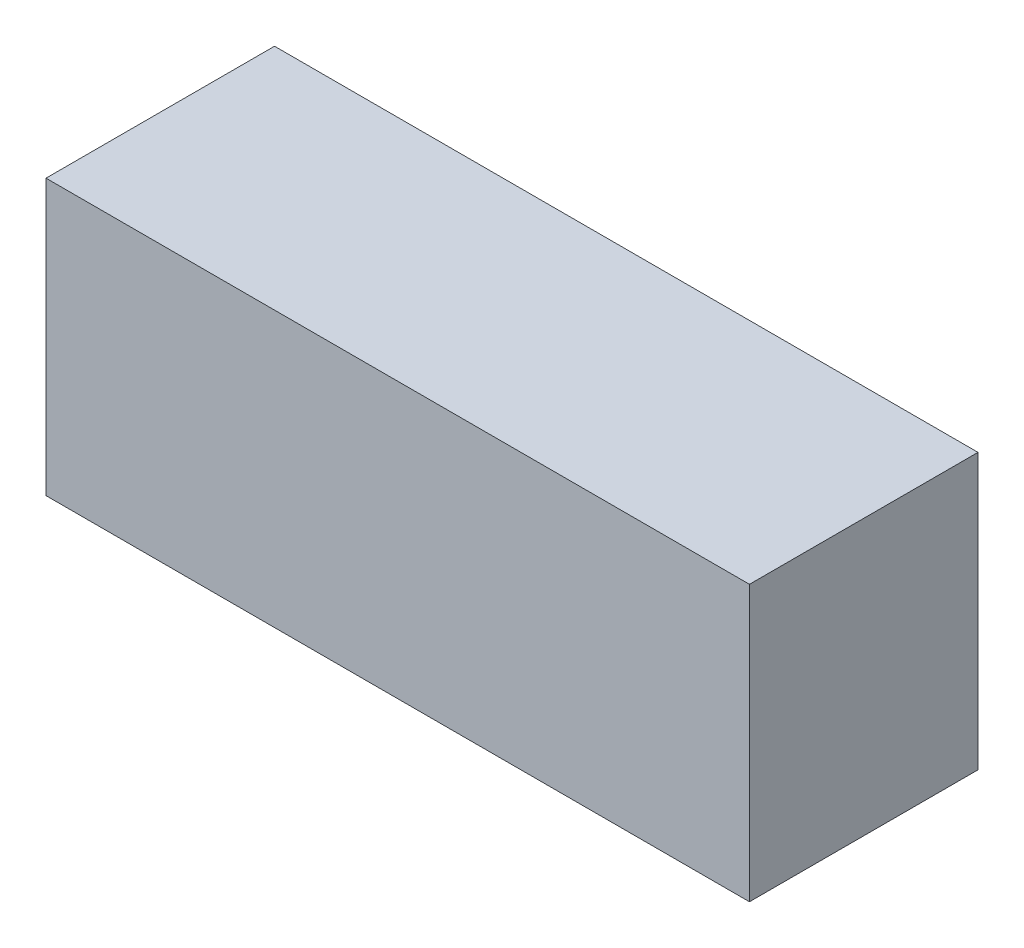
ISO-10303-21;
HEADER;
FILE_DESCRIPTION(('STEP AP214'),'2;1');
FILE_NAME('part.step','',(''),(''),'','','');
FILE_SCHEMA(('AUTOMOTIVE_DESIGN { 1 0 10303 214 1 1 1 1 }'));
ENDSEC;
DATA;
#1=APPLICATION_CONTEXT('core data for automotive mechanical design processes');
#2=APPLICATION_PROTOCOL_DEFINITION('international standard','automotive_design',2000,#1);
#3=PRODUCT_CONTEXT('',#1,'mechanical');
#4=PRODUCT('Part','Part','',(#3));
#5=PRODUCT_RELATED_PRODUCT_CATEGORY('part','',(#4));
#6=PRODUCT_DEFINITION_FORMATION('','',#4);
#7=PRODUCT_DEFINITION_CONTEXT('part definition',#1,'design');
#8=PRODUCT_DEFINITION('design','',#6,#7);
#9=PRODUCT_DEFINITION_SHAPE('','',#8);
#10=(LENGTH_UNIT() NAMED_UNIT(*) SI_UNIT(.MILLI.,.METRE.));
#11=(NAMED_UNIT(*) PLANE_ANGLE_UNIT() SI_UNIT($,.RADIAN.));
#12=(NAMED_UNIT(*) SI_UNIT($,.STERADIAN.) SOLID_ANGLE_UNIT());
#13=UNCERTAINTY_MEASURE_WITH_UNIT(LENGTH_MEASURE(1.E-05),#10,'distance_accuracy_value','');
#14=(GEOMETRIC_REPRESENTATION_CONTEXT(3) GLOBAL_UNCERTAINTY_ASSIGNED_CONTEXT((#13)) GLOBAL_UNIT_ASSIGNED_CONTEXT((#10,
#11,#12)) REPRESENTATION_CONTEXT('',''));
#15=CARTESIAN_POINT('',(0.,0.,0.));
#16=DIRECTION('',(0.,0.,1.));
#17=DIRECTION('',(1.,0.,0.));
#18=AXIS2_PLACEMENT_3D('',#15,#16,#17);
#19=CARTESIAN_POINT('',(-65.03868899856,-38.5,-65.34864586532));
#20=DIRECTION('',(0.,0.,1.));
#21=DIRECTION('',(1.,0.,0.));
#22=AXIS2_PLACEMENT_3D('',#19,#20,#21);
#23=PLANE('',#22);
#24=DIRECTION('',(0.,1.,0.));
#25=VECTOR('',#24,1.);
#26=CARTESIAN_POINT('',(-65.03868899856,-38.5,-65.34864586532));
#27=LINE('',#26,#25);
#28=CARTESIAN_POINT('',(-65.03868899856,-38.5,-65.34864586532));
#29=VERTEX_POINT('',#28);
#30=CARTESIAN_POINT('',(-65.03868899856,38.5,-65.34864586532));
#31=VERTEX_POINT('',#30);
#32=EDGE_CURVE('E87',#29,#31,#27,.T.);
#33=ORIENTED_EDGE('',*,*,#32,.F.);
#34=DIRECTION('',(1.,0.,0.));
#35=VECTOR('',#34,1.);
#36=CARTESIAN_POINT('',(-65.03868899856,-38.5,-65.34864586532));
#37=LINE('',#36,#35);
#38=CARTESIAN_POINT('',(131.961311001,-38.5,-65.34864586532));
#39=VERTEX_POINT('',#38);
#40=EDGE_CURVE('E69',#29,#39,#37,.T.);
#41=ORIENTED_EDGE('',*,*,#40,.T.);
#42=DIRECTION('',(0.,1.,0.));
#43=VECTOR('',#42,1.);
#44=CARTESIAN_POINT('',(131.961311001,-38.5,-65.34864586532));
#45=LINE('',#44,#43);
#46=CARTESIAN_POINT('',(131.961311001,38.5,-65.34864586532));
#47=VERTEX_POINT('',#46);
#48=EDGE_CURVE('E81',#39,#47,#45,.T.);
#49=ORIENTED_EDGE('',*,*,#48,.T.);
#50=DIRECTION('',(1.,0.,0.));
#51=VECTOR('',#50,1.);
#52=CARTESIAN_POINT('',(-65.03868899856,38.5,-65.34864586532));
#53=LINE('',#52,#51);
#54=EDGE_CURVE('E10',#31,#47,#53,.T.);
#55=ORIENTED_EDGE('',*,*,#54,.F.);
#56=EDGE_LOOP('',(#33,#41,#49,#55));
#57=FACE_BOUND('',#56,.T.);
#58=ADVANCED_FACE('F16',(#57),#23,.T.);
#59=CARTESIAN_POINT('',(-65.03868899856,-38.5,-129.348645865));
#60=DIRECTION('',(0.,0.,1.));
#61=DIRECTION('',(1.,0.,0.));
#62=AXIS2_PLACEMENT_3D('',#59,#60,#61);
#63=PLANE('',#62);
#64=DIRECTION('',(1.,0.,0.));
#65=VECTOR('',#64,1.);
#66=CARTESIAN_POINT('',(-65.03868899856,38.5,-129.348645865));
#67=LINE('',#66,#65);
#68=CARTESIAN_POINT('',(-65.03868899856,38.5,-129.348645865));
#69=VERTEX_POINT('',#68);
#70=CARTESIAN_POINT('',(131.961311001,38.5,-129.348645865));
#71=VERTEX_POINT('',#70);
#72=EDGE_CURVE('E24',#69,#71,#67,.T.);
#73=ORIENTED_EDGE('',*,*,#72,.T.);
#74=DIRECTION('',(0.,1.,0.));
#75=VECTOR('',#74,1.);
#76=CARTESIAN_POINT('',(131.961311001,-38.5,-129.348645865));
#77=LINE('',#76,#75);
#78=CARTESIAN_POINT('',(131.961311001,-38.5,-129.348645865));
#79=VERTEX_POINT('',#78);
#80=EDGE_CURVE('E102',#79,#71,#77,.T.);
#81=ORIENTED_EDGE('',*,*,#80,.F.);
#82=DIRECTION('',(1.,0.,0.));
#83=VECTOR('',#82,1.);
#84=CARTESIAN_POINT('',(-65.03868899856,-38.5,-129.348645865));
#85=LINE('',#84,#83);
#86=CARTESIAN_POINT('',(-65.03868899856,-38.5,-129.348645865));
#87=VERTEX_POINT('',#86);
#88=EDGE_CURVE('E80',#87,#79,#85,.T.);
#89=ORIENTED_EDGE('',*,*,#88,.F.);
#90=DIRECTION('',(0.,1.,0.));
#91=VECTOR('',#90,1.);
#92=CARTESIAN_POINT('',(-65.03868899856,-38.5,-129.348645865));
#93=LINE('',#92,#91);
#94=EDGE_CURVE('E88',#87,#69,#93,.T.);
#95=ORIENTED_EDGE('',*,*,#94,.T.);
#96=EDGE_LOOP('',(#73,#81,#89,#95));
#97=FACE_BOUND('',#96,.T.);
#98=ADVANCED_FACE('F149',(#97),#63,.F.);
#99=CARTESIAN_POINT('',(-65.03868899856,38.5,-129.348645865));
#100=DIRECTION('',(0.,1.,0.));
#101=DIRECTION('',(1.,0.,0.));
#102=AXIS2_PLACEMENT_3D('',#99,#100,#101);
#103=PLANE('',#102);
#104=ORIENTED_EDGE('',*,*,#72,.F.);
#105=DIRECTION('',(0.,0.,1.));
#106=VECTOR('',#105,1.);
#107=CARTESIAN_POINT('',(-65.03868899856,38.5,-129.348645865));
#108=LINE('',#107,#106);
#109=EDGE_CURVE('E92',#69,#31,#108,.T.);
#110=ORIENTED_EDGE('',*,*,#109,.T.);
#111=ORIENTED_EDGE('',*,*,#54,.T.);
#112=DIRECTION('',(0.,0.,1.));
#113=VECTOR('',#112,1.);
#114=CARTESIAN_POINT('',(131.961311001,38.5,-129.348645865));
#115=LINE('',#114,#113);
#116=EDGE_CURVE('E105',#71,#47,#115,.T.);
#117=ORIENTED_EDGE('',*,*,#116,.F.);
#118=EDGE_LOOP('',(#104,#110,#111,#117));
#119=FACE_BOUND('',#118,.T.);
#120=ADVANCED_FACE('F141',(#119),#103,.T.);
#121=CARTESIAN_POINT('',(-65.03868899856,-38.5,-129.348645865));
#122=DIRECTION('',(0.,1.,0.));
#123=DIRECTION('',(1.,0.,0.));
#124=AXIS2_PLACEMENT_3D('',#121,#122,#123);
#125=PLANE('',#124);
#126=DIRECTION('',(0.,0.,1.));
#127=VECTOR('',#126,1.);
#128=CARTESIAN_POINT('',(131.961311001,-38.5,-129.348645865));
#129=LINE('',#128,#127);
#130=EDGE_CURVE('E75',#79,#39,#129,.T.);
#131=ORIENTED_EDGE('',*,*,#130,.T.);
#132=ORIENTED_EDGE('',*,*,#40,.F.);
#133=DIRECTION('',(0.,0.,1.));
#134=VECTOR('',#133,1.);
#135=CARTESIAN_POINT('',(-65.03868899856,-38.5,-129.348645865));
#136=LINE('',#135,#134);
#137=EDGE_CURVE('E72',#87,#29,#136,.T.);
#138=ORIENTED_EDGE('',*,*,#137,.F.);
#139=ORIENTED_EDGE('',*,*,#88,.T.);
#140=EDGE_LOOP('',(#131,#132,#138,#139));
#141=FACE_BOUND('',#140,.T.);
#142=ADVANCED_FACE('F71',(#141),#125,.F.);
#143=CARTESIAN_POINT('',(131.961311001,-38.5,-129.348645865));
#144=DIRECTION('',(1.,0.,0.));
#145=DIRECTION('',(0.,1.,0.));
#146=AXIS2_PLACEMENT_3D('',#143,#144,#145);
#147=PLANE('',#146);
#148=ORIENTED_EDGE('',*,*,#130,.F.);
#149=ORIENTED_EDGE('',*,*,#80,.T.);
#150=ORIENTED_EDGE('',*,*,#116,.T.);
#151=ORIENTED_EDGE('',*,*,#48,.F.);
#152=EDGE_LOOP('',(#148,#149,#150,#151));
#153=FACE_BOUND('',#152,.T.);
#154=ADVANCED_FACE('F124',(#153),#147,.T.);
#155=CARTESIAN_POINT('',(-65.03868899856,-38.5,-129.348645865));
#156=DIRECTION('',(1.,0.,0.));
#157=DIRECTION('',(0.,1.,0.));
#158=AXIS2_PLACEMENT_3D('',#155,#156,#157);
#159=PLANE('',#158);
#160=ORIENTED_EDGE('',*,*,#32,.T.);
#161=ORIENTED_EDGE('',*,*,#109,.F.);
#162=ORIENTED_EDGE('',*,*,#94,.F.);
#163=ORIENTED_EDGE('',*,*,#137,.T.);
#164=EDGE_LOOP('',(#160,#161,#162,#163));
#165=FACE_BOUND('',#164,.T.);
#166=ADVANCED_FACE('F85',(#165),#159,.F.);
#167=CLOSED_SHELL('',(#58,#98,#120,#142,#154,#166));
#168=MANIFOLD_SOLID_BREP('B1',#167);
#169=ADVANCED_BREP_SHAPE_REPRESENTATION('',(#18,#168),#14);
#170=SHAPE_DEFINITION_REPRESENTATION(#9,#169);
ENDSEC;
END-ISO-10303-21;
